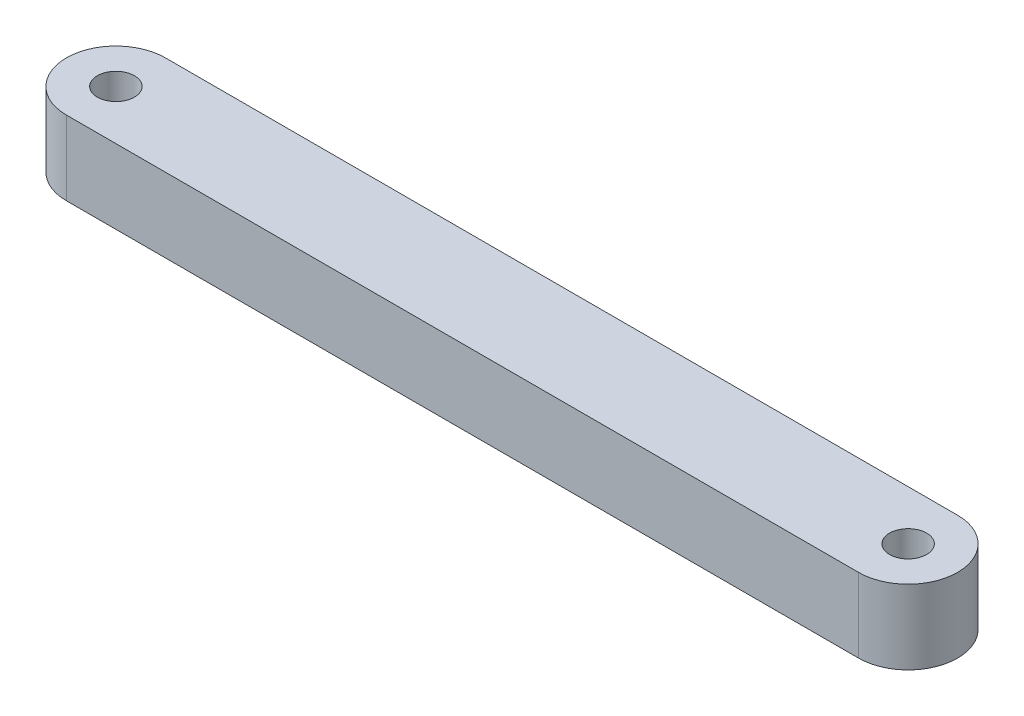
ISO-10303-21;
HEADER;
FILE_DESCRIPTION(('STEP AP214'),'2;1');
FILE_NAME('part.step','',(''),(''),'','','');
FILE_SCHEMA(('AUTOMOTIVE_DESIGN { 1 0 10303 214 1 1 1 1 }'));
ENDSEC;
DATA;
#1=APPLICATION_CONTEXT('core data for automotive mechanical design processes');
#2=APPLICATION_PROTOCOL_DEFINITION('international standard','automotive_design',2000,#1);
#3=PRODUCT_CONTEXT('',#1,'mechanical');
#4=PRODUCT('Part','Part','',(#3));
#5=PRODUCT_RELATED_PRODUCT_CATEGORY('part','',(#4));
#6=PRODUCT_DEFINITION_FORMATION('','',#4);
#7=PRODUCT_DEFINITION_CONTEXT('part definition',#1,'design');
#8=PRODUCT_DEFINITION('design','',#6,#7);
#9=PRODUCT_DEFINITION_SHAPE('','',#8);
#10=(LENGTH_UNIT() NAMED_UNIT(*) SI_UNIT(.MILLI.,.METRE.));
#11=(NAMED_UNIT(*) PLANE_ANGLE_UNIT() SI_UNIT($,.RADIAN.));
#12=(NAMED_UNIT(*) SI_UNIT($,.STERADIAN.) SOLID_ANGLE_UNIT());
#13=UNCERTAINTY_MEASURE_WITH_UNIT(LENGTH_MEASURE(1.E-05),#10,'distance_accuracy_value','');
#14=(GEOMETRIC_REPRESENTATION_CONTEXT(3) GLOBAL_UNCERTAINTY_ASSIGNED_CONTEXT((#13)) GLOBAL_UNIT_ASSIGNED_CONTEXT((#10,
#11,#12)) REPRESENTATION_CONTEXT('',''));
#15=CARTESIAN_POINT('',(0.,0.,0.));
#16=DIRECTION('',(0.,0.,1.));
#17=DIRECTION('',(1.,0.,0.));
#18=AXIS2_PLACEMENT_3D('',#15,#16,#17);
#19=CARTESIAN_POINT('',(80.,15.,0.));
#20=DIRECTION('',(0.,-1.,0.));
#21=DIRECTION('',(0.,0.,-1.));
#22=AXIS2_PLACEMENT_3D('',#19,#20,#21);
#23=CYLINDRICAL_SURFACE('',#22,10.);
#24=CARTESIAN_POINT('',(80.,0.,0.));
#25=DIRECTION('',(0.,1.,0.));
#26=DIRECTION('',(0.,0.,-1.));
#27=AXIS2_PLACEMENT_3D('',#24,#25,#26);
#28=CIRCLE('',#27,10.);
#29=CARTESIAN_POINT('',(80.,0.,10.));
#30=VERTEX_POINT('',#29);
#31=CARTESIAN_POINT('',(80.,0.,-10.));
#32=VERTEX_POINT('',#31);
#33=EDGE_CURVE('E99',#30,#32,#28,.T.);
#34=ORIENTED_EDGE('',*,*,#33,.T.);
#35=DIRECTION('',(0.,-1.,0.));
#36=VECTOR('',#35,1.);
#37=CARTESIAN_POINT('',(80.,15.,-10.));
#38=LINE('',#37,#36);
#39=CARTESIAN_POINT('',(80.,15.,-10.));
#40=VERTEX_POINT('',#39);
#41=EDGE_CURVE('E11',#40,#32,#38,.T.);
#42=ORIENTED_EDGE('',*,*,#41,.F.);
#43=CARTESIAN_POINT('',(80.,15.,0.));
#44=DIRECTION('',(0.,1.,0.));
#45=DIRECTION('',(0.,0.,-1.));
#46=AXIS2_PLACEMENT_3D('',#43,#44,#45);
#47=CIRCLE('',#46,10.);
#48=CARTESIAN_POINT('',(80.,15.,10.));
#49=VERTEX_POINT('',#48);
#50=EDGE_CURVE('E87',#49,#40,#47,.T.);
#51=ORIENTED_EDGE('',*,*,#50,.F.);
#52=DIRECTION('',(0.,-1.,0.));
#53=VECTOR('',#52,1.);
#54=CARTESIAN_POINT('',(80.,15.,10.));
#55=LINE('',#54,#53);
#56=EDGE_CURVE('E95',#49,#30,#55,.T.);
#57=ORIENTED_EDGE('',*,*,#56,.T.);
#58=EDGE_LOOP('',(#34,#42,#51,#57));
#59=FACE_BOUND('',#58,.T.);
#60=ADVANCED_FACE('F36',(#59),#23,.T.);
#61=CARTESIAN_POINT('',(-80.,15.,-10.));
#62=DIRECTION('',(0.,0.,1.));
#63=DIRECTION('',(1.,0.,0.));
#64=AXIS2_PLACEMENT_3D('',#61,#62,#63);
#65=PLANE('',#64);
#66=DIRECTION('',(-1.,0.,0.));
#67=VECTOR('',#66,1.);
#68=CARTESIAN_POINT('',(-80.,0.,-10.));
#69=LINE('',#68,#67);
#70=CARTESIAN_POINT('',(-80.,0.,-10.));
#71=VERTEX_POINT('',#70);
#72=EDGE_CURVE('E91',#32,#71,#69,.T.);
#73=ORIENTED_EDGE('',*,*,#72,.T.);
#74=DIRECTION('',(0.,-1.,0.));
#75=VECTOR('',#74,1.);
#76=CARTESIAN_POINT('',(-80.,15.,-10.));
#77=LINE('',#76,#75);
#78=CARTESIAN_POINT('',(-80.,15.,-10.));
#79=VERTEX_POINT('',#78);
#80=EDGE_CURVE('E44',#79,#71,#77,.T.);
#81=ORIENTED_EDGE('',*,*,#80,.F.);
#82=DIRECTION('',(-1.,0.,0.));
#83=VECTOR('',#82,1.);
#84=CARTESIAN_POINT('',(-80.,15.,-10.));
#85=LINE('',#84,#83);
#86=EDGE_CURVE('E82',#40,#79,#85,.T.);
#87=ORIENTED_EDGE('',*,*,#86,.F.);
#88=ORIENTED_EDGE('',*,*,#41,.T.);
#89=EDGE_LOOP('',(#73,#81,#87,#88));
#90=FACE_BOUND('',#89,.T.);
#91=ADVANCED_FACE('F90',(#90),#65,.F.);
#92=CARTESIAN_POINT('',(-80.,15.,0.));
#93=DIRECTION('',(0.,-1.,0.));
#94=DIRECTION('',(0.,0.,-1.));
#95=AXIS2_PLACEMENT_3D('',#92,#93,#94);
#96=CYLINDRICAL_SURFACE('',#95,10.);
#97=CARTESIAN_POINT('',(-80.,0.,0.));
#98=DIRECTION('',(0.,1.,0.));
#99=DIRECTION('',(0.,0.,1.));
#100=AXIS2_PLACEMENT_3D('',#97,#98,#99);
#101=CIRCLE('',#100,10.);
#102=CARTESIAN_POINT('',(-80.,0.,10.));
#103=VERTEX_POINT('',#102);
#104=EDGE_CURVE('E69',#71,#103,#101,.T.);
#105=ORIENTED_EDGE('',*,*,#104,.T.);
#106=DIRECTION('',(0.,-1.,0.));
#107=VECTOR('',#106,1.);
#108=CARTESIAN_POINT('',(-80.,15.,10.));
#109=LINE('',#108,#107);
#110=CARTESIAN_POINT('',(-80.,15.,10.));
#111=VERTEX_POINT('',#110);
#112=EDGE_CURVE('E92',#111,#103,#109,.T.);
#113=ORIENTED_EDGE('',*,*,#112,.F.);
#114=CARTESIAN_POINT('',(-80.,15.,0.));
#115=DIRECTION('',(0.,1.,0.));
#116=DIRECTION('',(0.,0.,1.));
#117=AXIS2_PLACEMENT_3D('',#114,#115,#116);
#118=CIRCLE('',#117,10.);
#119=EDGE_CURVE('E85',#79,#111,#118,.T.);
#120=ORIENTED_EDGE('',*,*,#119,.F.);
#121=ORIENTED_EDGE('',*,*,#80,.T.);
#122=EDGE_LOOP('',(#105,#113,#120,#121));
#123=FACE_BOUND('',#122,.T.);
#124=ADVANCED_FACE('F93',(#123),#96,.T.);
#125=CARTESIAN_POINT('',(-80.,15.,10.));
#126=DIRECTION('',(0.,0.,-1.));
#127=DIRECTION('',(-1.,0.,0.));
#128=AXIS2_PLACEMENT_3D('',#125,#126,#127);
#129=PLANE('',#128);
#130=DIRECTION('',(1.,0.,0.));
#131=VECTOR('',#130,1.);
#132=CARTESIAN_POINT('',(-80.,0.,10.));
#133=LINE('',#132,#131);
#134=EDGE_CURVE('E75',#103,#30,#133,.T.);
#135=ORIENTED_EDGE('',*,*,#134,.T.);
#136=ORIENTED_EDGE('',*,*,#56,.F.);
#137=DIRECTION('',(1.,0.,0.));
#138=VECTOR('',#137,1.);
#139=CARTESIAN_POINT('',(-80.,15.,10.));
#140=LINE('',#139,#138);
#141=EDGE_CURVE('E52',#111,#49,#140,.T.);
#142=ORIENTED_EDGE('',*,*,#141,.F.);
#143=ORIENTED_EDGE('',*,*,#112,.T.);
#144=EDGE_LOOP('',(#135,#136,#142,#143));
#145=FACE_BOUND('',#144,.T.);
#146=ADVANCED_FACE('F107',(#145),#129,.F.);
#147=CARTESIAN_POINT('',(80.,15.,0.));
#148=DIRECTION('',(0.,-1.,0.));
#149=DIRECTION('',(0.,0.,-1.));
#150=AXIS2_PLACEMENT_3D('',#147,#148,#149);
#151=PLANE('',#150);
#152=CARTESIAN_POINT('',(-80.,15.,0.));
#153=DIRECTION('',(0.,1.,0.));
#154=DIRECTION('',(0.,0.,1.));
#155=AXIS2_PLACEMENT_3D('',#152,#153,#154);
#156=CIRCLE('',#155,3.75000000000001);
#157=CARTESIAN_POINT('',(-80.,15.,3.75000000000001));
#158=VERTEX_POINT('',#157);
#159=EDGE_CURVE('E119',#158,#158,#156,.T.);
#160=ORIENTED_EDGE('',*,*,#159,.F.);
#161=EDGE_LOOP('',(#160));
#162=FACE_BOUND('',#161,.T.);
#163=CARTESIAN_POINT('',(80.,15.,0.));
#164=DIRECTION('',(0.,1.,0.));
#165=DIRECTION('',(0.,0.,1.));
#166=AXIS2_PLACEMENT_3D('',#163,#164,#165);
#167=CIRCLE('',#166,3.75000000000001);
#168=CARTESIAN_POINT('',(80.,15.,3.75000000000001));
#169=VERTEX_POINT('',#168);
#170=EDGE_CURVE('E113',#169,#169,#167,.T.);
#171=ORIENTED_EDGE('',*,*,#170,.F.);
#172=EDGE_LOOP('',(#171));
#173=FACE_BOUND('',#172,.T.);
#174=ORIENTED_EDGE('',*,*,#50,.T.);
#175=ORIENTED_EDGE('',*,*,#86,.T.);
#176=ORIENTED_EDGE('',*,*,#119,.T.);
#177=ORIENTED_EDGE('',*,*,#141,.T.);
#178=EDGE_LOOP('',(#174,#175,#176,#177));
#179=FACE_BOUND('',#178,.T.);
#180=ADVANCED_FACE('F83',(#162,#173,#179),#151,.F.);
#181=CARTESIAN_POINT('',(80.,0.,0.));
#182=DIRECTION('',(0.,-1.,0.));
#183=DIRECTION('',(0.,0.,-1.));
#184=AXIS2_PLACEMENT_3D('',#181,#182,#183);
#185=PLANE('',#184);
#186=ORIENTED_EDGE('',*,*,#33,.F.);
#187=ORIENTED_EDGE('',*,*,#134,.F.);
#188=ORIENTED_EDGE('',*,*,#104,.F.);
#189=ORIENTED_EDGE('',*,*,#72,.F.);
#190=EDGE_LOOP('',(#186,#187,#188,#189));
#191=FACE_BOUND('',#190,.T.);
#192=ADVANCED_FACE('F110',(#191),#185,.T.);
#193=CARTESIAN_POINT('',(80.,5.,0.));
#194=DIRECTION('',(0.,1.,0.));
#195=DIRECTION('',(0.,0.,1.));
#196=AXIS2_PLACEMENT_3D('',#193,#194,#195);
#197=CYLINDRICAL_SURFACE('',#196,3.75000000000001);
#198=CARTESIAN_POINT('',(80.,5.,0.));
#199=DIRECTION('',(0.,1.,0.));
#200=DIRECTION('',(0.,0.,1.));
#201=AXIS2_PLACEMENT_3D('',#198,#199,#200);
#202=CIRCLE('',#201,3.75000000000001);
#203=CARTESIAN_POINT('',(80.,5.,3.75000000000001));
#204=VERTEX_POINT('',#203);
#205=EDGE_CURVE('E102',#204,#204,#202,.T.);
#206=ORIENTED_EDGE('',*,*,#205,.F.);
#207=EDGE_LOOP('',(#206));
#208=FACE_BOUND('',#207,.T.);
#209=ORIENTED_EDGE('',*,*,#170,.T.);
#210=EDGE_LOOP('',(#209));
#211=FACE_BOUND('',#210,.T.);
#212=ADVANCED_FACE('F139',(#208,#211),#197,.F.);
#213=CARTESIAN_POINT('',(80.,5.,0.));
#214=DIRECTION('',(0.,1.,0.));
#215=DIRECTION('',(0.,0.,1.));
#216=AXIS2_PLACEMENT_3D('',#213,#214,#215);
#217=PLANE('',#216);
#218=ORIENTED_EDGE('',*,*,#205,.T.);
#219=EDGE_LOOP('',(#218));
#220=FACE_BOUND('',#219,.T.);
#221=ADVANCED_FACE('F130',(#220),#217,.T.);
#222=CARTESIAN_POINT('',(-80.,5.,0.));
#223=DIRECTION('',(0.,1.,0.));
#224=DIRECTION('',(0.,0.,1.));
#225=AXIS2_PLACEMENT_3D('',#222,#223,#224);
#226=CYLINDRICAL_SURFACE('',#225,3.75000000000001);
#227=CARTESIAN_POINT('',(-80.,5.,0.));
#228=DIRECTION('',(0.,1.,0.));
#229=DIRECTION('',(0.,0.,1.));
#230=AXIS2_PLACEMENT_3D('',#227,#228,#229);
#231=CIRCLE('',#230,3.75000000000001);
#232=CARTESIAN_POINT('',(-80.,5.,3.75000000000001));
#233=VERTEX_POINT('',#232);
#234=EDGE_CURVE('E116',#233,#233,#231,.T.);
#235=ORIENTED_EDGE('',*,*,#234,.F.);
#236=EDGE_LOOP('',(#235));
#237=FACE_BOUND('',#236,.T.);
#238=ORIENTED_EDGE('',*,*,#159,.T.);
#239=EDGE_LOOP('',(#238));
#240=FACE_BOUND('',#239,.T.);
#241=ADVANCED_FACE('F127',(#237,#240),#226,.F.);
#242=CARTESIAN_POINT('',(-80.,5.,0.));
#243=DIRECTION('',(0.,1.,0.));
#244=DIRECTION('',(0.,0.,1.));
#245=AXIS2_PLACEMENT_3D('',#242,#243,#244);
#246=PLANE('',#245);
#247=ORIENTED_EDGE('',*,*,#234,.T.);
#248=EDGE_LOOP('',(#247));
#249=FACE_BOUND('',#248,.T.);
#250=ADVANCED_FACE('F125',(#249),#246,.T.);
#251=CLOSED_SHELL('',(#60,#91,#124,#146,#180,#192,#212,#221,#241,#250));
#252=MANIFOLD_SOLID_BREP('B2',#251);
#253=ADVANCED_BREP_SHAPE_REPRESENTATION('',(#18,#252),#14);
#254=SHAPE_DEFINITION_REPRESENTATION(#9,#253);
ENDSEC;
END-ISO-10303-21;
